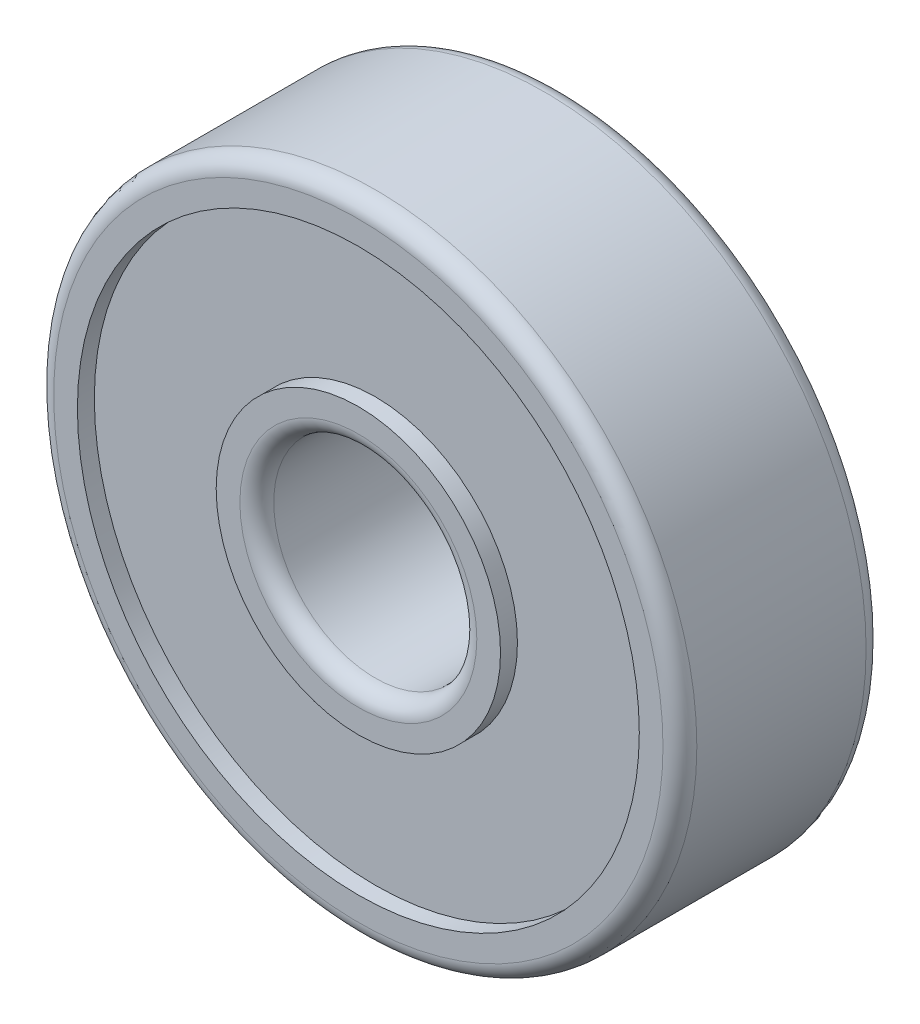
ISO-10303-21;
HEADER;
FILE_DESCRIPTION(('STEP AP214'),'2;1');
FILE_NAME('part.step','',(''),(''),'','','');
FILE_SCHEMA(('AUTOMOTIVE_DESIGN { 1 0 10303 214 1 1 1 1 }'));
ENDSEC;
DATA;
#1=APPLICATION_CONTEXT('core data for automotive mechanical design processes');
#2=APPLICATION_PROTOCOL_DEFINITION('international standard','automotive_design',2000,#1);
#3=PRODUCT_CONTEXT('',#1,'mechanical');
#4=PRODUCT('Part','Part','',(#3));
#5=PRODUCT_RELATED_PRODUCT_CATEGORY('part','',(#4));
#6=PRODUCT_DEFINITION_FORMATION('','',#4);
#7=PRODUCT_DEFINITION_CONTEXT('part definition',#1,'design');
#8=PRODUCT_DEFINITION('design','',#6,#7);
#9=PRODUCT_DEFINITION_SHAPE('','',#8);
#10=(LENGTH_UNIT() NAMED_UNIT(*) SI_UNIT(.MILLI.,.METRE.));
#11=(NAMED_UNIT(*) PLANE_ANGLE_UNIT() SI_UNIT($,.RADIAN.));
#12=(NAMED_UNIT(*) SI_UNIT($,.STERADIAN.) SOLID_ANGLE_UNIT());
#13=UNCERTAINTY_MEASURE_WITH_UNIT(LENGTH_MEASURE(1.E-05),#10,'distance_accuracy_value','');
#14=(GEOMETRIC_REPRESENTATION_CONTEXT(3) GLOBAL_UNCERTAINTY_ASSIGNED_CONTEXT((#13)) GLOBAL_UNIT_ASSIGNED_CONTEXT((#10,
#11,#12)) REPRESENTATION_CONTEXT('',''));
#15=CARTESIAN_POINT('',(0.,0.,0.));
#16=DIRECTION('',(0.,0.,1.));
#17=DIRECTION('',(1.,0.,0.));
#18=AXIS2_PLACEMENT_3D('',#15,#16,#17);
#19=CARTESIAN_POINT('',(0.,0.,0.));
#20=DIRECTION('',(0.,0.,1.));
#21=DIRECTION('',(1.,0.,0.));
#22=AXIS2_PLACEMENT_3D('',#19,#20,#21);
#23=PLANE('',#22);
#24=CARTESIAN_POINT('',(0.,0.,0.));
#25=DIRECTION('',(0.,0.,1.));
#26=DIRECTION('',(1.,0.,0.));
#27=AXIS2_PLACEMENT_3D('',#24,#25,#26);
#28=CIRCLE('',#27,3.5);
#29=CARTESIAN_POINT('',(3.5,0.,0.));
#30=VERTEX_POINT('',#29);
#31=EDGE_CURVE('E72',#30,#30,#28,.T.);
#32=ORIENTED_EDGE('',*,*,#31,.T.);
#33=EDGE_LOOP('',(#32));
#34=FACE_BOUND('',#33,.T.);
#35=CARTESIAN_POINT('',(0.,0.,0.));
#36=DIRECTION('',(0.,0.,-1.));
#37=DIRECTION('',(-1.,0.,0.));
#38=AXIS2_PLACEMENT_3D('',#35,#36,#37);
#39=CIRCLE('',#38,4.2);
#40=CARTESIAN_POINT('',(-4.2,0.,0.));
#41=VERTEX_POINT('',#40);
#42=EDGE_CURVE('E94',#41,#41,#39,.T.);
#43=ORIENTED_EDGE('',*,*,#42,.T.);
#44=EDGE_LOOP('',(#43));
#45=FACE_BOUND('',#44,.T.);
#46=ADVANCED_FACE('F43',(#34,#45),#23,.F.);
#47=CARTESIAN_POINT('',(0.,0.,6.));
#48=DIRECTION('',(0.,0.,1.));
#49=DIRECTION('',(1.,0.,0.));
#50=AXIS2_PLACEMENT_3D('',#47,#48,#49);
#51=PLANE('',#50);
#52=CARTESIAN_POINT('',(0.,0.,6.));
#53=DIRECTION('',(0.,0.,1.));
#54=DIRECTION('',(1.,0.,0.));
#55=AXIS2_PLACEMENT_3D('',#52,#53,#54);
#56=CIRCLE('',#55,3.5);
#57=CARTESIAN_POINT('',(3.5,0.,6.));
#58=VERTEX_POINT('',#57);
#59=EDGE_CURVE('E63',#58,#58,#56,.F.);
#60=ORIENTED_EDGE('',*,*,#59,.T.);
#61=EDGE_LOOP('',(#60));
#62=FACE_BOUND('',#61,.T.);
#63=CARTESIAN_POINT('',(0.,0.,6.));
#64=DIRECTION('',(0.,0.,1.));
#65=DIRECTION('',(1.,0.,0.));
#66=AXIS2_PLACEMENT_3D('',#63,#64,#65);
#67=CIRCLE('',#66,4.2);
#68=CARTESIAN_POINT('',(4.2,0.,6.));
#69=VERTEX_POINT('',#68);
#70=EDGE_CURVE('E82',#69,#69,#67,.T.);
#71=ORIENTED_EDGE('',*,*,#70,.T.);
#72=EDGE_LOOP('',(#71));
#73=FACE_BOUND('',#72,.T.);
#74=ADVANCED_FACE('F128',(#62,#73),#51,.T.);
#75=CARTESIAN_POINT('',(0.,0.,6.));
#76=DIRECTION('',(0.,0.,1.));
#77=DIRECTION('',(1.,0.,0.));
#78=AXIS2_PLACEMENT_3D('',#75,#76,#77);
#79=CIRCLE('',#78,9.);
#80=CARTESIAN_POINT('',(9.,0.,6.));
#81=VERTEX_POINT('',#80);
#82=EDGE_CURVE('E10',#81,#81,#79,.T.);
#83=ORIENTED_EDGE('',*,*,#82,.T.);
#84=EDGE_LOOP('',(#83));
#85=FACE_BOUND('',#84,.T.);
#86=CARTESIAN_POINT('',(0.,0.,6.));
#87=DIRECTION('',(0.,0.,1.));
#88=DIRECTION('',(1.,0.,0.));
#89=AXIS2_PLACEMENT_3D('',#86,#87,#88);
#90=CIRCLE('',#89,8.3);
#91=CARTESIAN_POINT('',(8.3,0.,6.));
#92=VERTEX_POINT('',#91);
#93=EDGE_CURVE('E76',#92,#92,#90,.T.);
#94=ORIENTED_EDGE('',*,*,#93,.F.);
#95=EDGE_LOOP('',(#94));
#96=FACE_BOUND('',#95,.T.);
#97=ADVANCED_FACE('F119',(#85,#96),#51,.T.);
#98=CARTESIAN_POINT('',(0.,0.,0.));
#99=DIRECTION('',(0.,0.,1.));
#100=DIRECTION('',(1.,0.,0.));
#101=AXIS2_PLACEMENT_3D('',#98,#99,#100);
#102=CIRCLE('',#101,9.);
#103=CARTESIAN_POINT('',(9.,0.,0.));
#104=VERTEX_POINT('',#103);
#105=EDGE_CURVE('E50',#104,#104,#102,.F.);
#106=ORIENTED_EDGE('',*,*,#105,.T.);
#107=EDGE_LOOP('',(#106));
#108=FACE_BOUND('',#107,.T.);
#109=CARTESIAN_POINT('',(0.,0.,0.));
#110=DIRECTION('',(0.,0.,-1.));
#111=DIRECTION('',(-1.,0.,0.));
#112=AXIS2_PLACEMENT_3D('',#109,#110,#111);
#113=CIRCLE('',#112,8.3);
#114=CARTESIAN_POINT('',(-8.3,0.,0.));
#115=VERTEX_POINT('',#114);
#116=EDGE_CURVE('E88',#115,#115,#113,.T.);
#117=ORIENTED_EDGE('',*,*,#116,.F.);
#118=EDGE_LOOP('',(#117));
#119=FACE_BOUND('',#118,.T.);
#120=ADVANCED_FACE('F116',(#108,#119),#23,.F.);
#121=CARTESIAN_POINT('',(0.,0.,6.));
#122=DIRECTION('',(0.,0.,-1.));
#123=DIRECTION('',(-1.,0.,0.));
#124=AXIS2_PLACEMENT_3D('',#121,#122,#123);
#125=CYLINDRICAL_SURFACE('',#124,9.5);
#126=CARTESIAN_POINT('',(0.,0.,0.5));
#127=DIRECTION('',(0.,0.,1.));
#128=DIRECTION('',(1.,0.,0.));
#129=AXIS2_PLACEMENT_3D('',#126,#127,#128);
#130=CIRCLE('',#129,9.5);
#131=CARTESIAN_POINT('',(9.5,0.,0.5));
#132=VERTEX_POINT('',#131);
#133=EDGE_CURVE('E54',#132,#132,#130,.T.);
#134=ORIENTED_EDGE('',*,*,#133,.T.);
#135=EDGE_LOOP('',(#134));
#136=FACE_BOUND('',#135,.T.);
#137=CARTESIAN_POINT('',(0.,0.,5.5));
#138=DIRECTION('',(0.,0.,1.));
#139=DIRECTION('',(1.,0.,0.));
#140=AXIS2_PLACEMENT_3D('',#137,#138,#139);
#141=CIRCLE('',#140,9.5);
#142=CARTESIAN_POINT('',(9.5,0.,5.5));
#143=VERTEX_POINT('',#142);
#144=EDGE_CURVE('E58',#143,#143,#141,.F.);
#145=ORIENTED_EDGE('',*,*,#144,.T.);
#146=EDGE_LOOP('',(#145));
#147=FACE_BOUND('',#146,.T.);
#148=ADVANCED_FACE('F118',(#136,#147),#125,.T.);
#149=CARTESIAN_POINT('',(0.,0.,6.));
#150=DIRECTION('',(0.,0.,-1.));
#151=DIRECTION('',(-1.,0.,0.));
#152=AXIS2_PLACEMENT_3D('',#149,#150,#151);
#153=CYLINDRICAL_SURFACE('',#152,3.);
#154=CARTESIAN_POINT('',(0.,0.,0.5));
#155=DIRECTION('',(0.,0.,1.));
#156=DIRECTION('',(1.,0.,0.));
#157=AXIS2_PLACEMENT_3D('',#154,#155,#156);
#158=CIRCLE('',#157,3.);
#159=CARTESIAN_POINT('',(3.,0.,0.5));
#160=VERTEX_POINT('',#159);
#161=EDGE_CURVE('E66',#160,#160,#158,.F.);
#162=ORIENTED_EDGE('',*,*,#161,.T.);
#163=EDGE_LOOP('',(#162));
#164=FACE_BOUND('',#163,.T.);
#165=CARTESIAN_POINT('',(0.,0.,5.5));
#166=DIRECTION('',(0.,0.,1.));
#167=DIRECTION('',(1.,0.,0.));
#168=AXIS2_PLACEMENT_3D('',#165,#166,#167);
#169=CIRCLE('',#168,3.);
#170=CARTESIAN_POINT('',(3.,0.,5.5));
#171=VERTEX_POINT('',#170);
#172=EDGE_CURVE('E69',#171,#171,#169,.T.);
#173=ORIENTED_EDGE('',*,*,#172,.T.);
#174=EDGE_LOOP('',(#173));
#175=FACE_BOUND('',#174,.T.);
#176=ADVANCED_FACE('F125',(#164,#175),#153,.F.);
#177=CARTESIAN_POINT('',(0.,0.,5.5));
#178=DIRECTION('',(0.,0.,1.));
#179=DIRECTION('',(1.,0.,0.));
#180=AXIS2_PLACEMENT_3D('',#177,#178,#179);
#181=CYLINDRICAL_SURFACE('',#180,8.3);
#182=CARTESIAN_POINT('',(0.,0.,5.5));
#183=DIRECTION('',(0.,0.,1.));
#184=DIRECTION('',(1.,0.,0.));
#185=AXIS2_PLACEMENT_3D('',#182,#183,#184);
#186=CIRCLE('',#185,8.3);
#187=CARTESIAN_POINT('',(8.3,0.,5.5));
#188=VERTEX_POINT('',#187);
#189=EDGE_CURVE('E75',#188,#188,#186,.T.);
#190=ORIENTED_EDGE('',*,*,#189,.F.);
#191=EDGE_LOOP('',(#190));
#192=FACE_BOUND('',#191,.T.);
#193=ORIENTED_EDGE('',*,*,#93,.T.);
#194=EDGE_LOOP('',(#193));
#195=FACE_BOUND('',#194,.T.);
#196=ADVANCED_FACE('F155',(#192,#195),#181,.F.);
#197=CARTESIAN_POINT('',(0.,0.,5.5));
#198=DIRECTION('',(0.,0.,1.));
#199=DIRECTION('',(1.,0.,0.));
#200=AXIS2_PLACEMENT_3D('',#197,#198,#199);
#201=PLANE('',#200);
#202=CARTESIAN_POINT('',(0.,0.,5.5));
#203=DIRECTION('',(0.,0.,1.));
#204=DIRECTION('',(1.,0.,0.));
#205=AXIS2_PLACEMENT_3D('',#202,#203,#204);
#206=CIRCLE('',#205,4.2);
#207=CARTESIAN_POINT('',(4.2,0.,5.5));
#208=VERTEX_POINT('',#207);
#209=EDGE_CURVE('E79',#208,#208,#206,.T.);
#210=ORIENTED_EDGE('',*,*,#209,.F.);
#211=EDGE_LOOP('',(#210));
#212=FACE_BOUND('',#211,.T.);
#213=ORIENTED_EDGE('',*,*,#189,.T.);
#214=EDGE_LOOP('',(#213));
#215=FACE_BOUND('',#214,.T.);
#216=ADVANCED_FACE('F151',(#212,#215),#201,.T.);
#217=CARTESIAN_POINT('',(0.,0.,5.5));
#218=DIRECTION('',(0.,0.,1.));
#219=DIRECTION('',(1.,0.,0.));
#220=AXIS2_PLACEMENT_3D('',#217,#218,#219);
#221=CYLINDRICAL_SURFACE('',#220,4.2);
#222=ORIENTED_EDGE('',*,*,#209,.T.);
#223=EDGE_LOOP('',(#222));
#224=FACE_BOUND('',#223,.T.);
#225=ORIENTED_EDGE('',*,*,#70,.F.);
#226=EDGE_LOOP('',(#225));
#227=FACE_BOUND('',#226,.T.);
#228=ADVANCED_FACE('F112',(#224,#227),#221,.T.);
#229=CARTESIAN_POINT('',(0.,0.,0.5));
#230=DIRECTION('',(0.,0.,-1.));
#231=DIRECTION('',(-1.,0.,0.));
#232=AXIS2_PLACEMENT_3D('',#229,#230,#231);
#233=CYLINDRICAL_SURFACE('',#232,8.3);
#234=CARTESIAN_POINT('',(0.,0.,0.5));
#235=DIRECTION('',(0.,0.,-1.));
#236=DIRECTION('',(-1.,0.,0.));
#237=AXIS2_PLACEMENT_3D('',#234,#235,#236);
#238=CIRCLE('',#237,8.3);
#239=CARTESIAN_POINT('',(-8.3,0.,0.5));
#240=VERTEX_POINT('',#239);
#241=EDGE_CURVE('E85',#240,#240,#238,.T.);
#242=ORIENTED_EDGE('',*,*,#241,.F.);
#243=EDGE_LOOP('',(#242));
#244=FACE_BOUND('',#243,.T.);
#245=ORIENTED_EDGE('',*,*,#116,.T.);
#246=EDGE_LOOP('',(#245));
#247=FACE_BOUND('',#246,.T.);
#248=ADVANCED_FACE('F106',(#244,#247),#233,.F.);
#249=CARTESIAN_POINT('',(0.,0.,0.5));
#250=DIRECTION('',(0.,0.,-1.));
#251=DIRECTION('',(-1.,0.,0.));
#252=AXIS2_PLACEMENT_3D('',#249,#250,#251);
#253=PLANE('',#252);
#254=CARTESIAN_POINT('',(0.,0.,0.5));
#255=DIRECTION('',(0.,0.,-1.));
#256=DIRECTION('',(-1.,0.,0.));
#257=AXIS2_PLACEMENT_3D('',#254,#255,#256);
#258=CIRCLE('',#257,4.2);
#259=CARTESIAN_POINT('',(-4.2,0.,0.5));
#260=VERTEX_POINT('',#259);
#261=EDGE_CURVE('E91',#260,#260,#258,.T.);
#262=ORIENTED_EDGE('',*,*,#261,.F.);
#263=EDGE_LOOP('',(#262));
#264=FACE_BOUND('',#263,.T.);
#265=ORIENTED_EDGE('',*,*,#241,.T.);
#266=EDGE_LOOP('',(#265));
#267=FACE_BOUND('',#266,.T.);
#268=ADVANCED_FACE('F103',(#264,#267),#253,.T.);
#269=CARTESIAN_POINT('',(0.,0.,0.5));
#270=DIRECTION('',(0.,0.,-1.));
#271=DIRECTION('',(-1.,0.,0.));
#272=AXIS2_PLACEMENT_3D('',#269,#270,#271);
#273=CYLINDRICAL_SURFACE('',#272,4.2);
#274=ORIENTED_EDGE('',*,*,#261,.T.);
#275=EDGE_LOOP('',(#274));
#276=FACE_BOUND('',#275,.T.);
#277=ORIENTED_EDGE('',*,*,#42,.F.);
#278=EDGE_LOOP('',(#277));
#279=FACE_BOUND('',#278,.T.);
#280=ADVANCED_FACE('F100',(#276,#279),#273,.T.);
#281=CARTESIAN_POINT('',(0.,0.,0.5));
#282=DIRECTION('',(0.,0.,1.));
#283=DIRECTION('',(1.,0.,0.));
#284=AXIS2_PLACEMENT_3D('',#281,#282,#283);
#285=TOROIDAL_SURFACE('',#284,3.5,0.5);
#286=ORIENTED_EDGE('',*,*,#161,.F.);
#287=EDGE_LOOP('',(#286));
#288=FACE_BOUND('',#287,.T.);
#289=ORIENTED_EDGE('',*,*,#31,.F.);
#290=EDGE_LOOP('',(#289));
#291=FACE_BOUND('',#290,.T.);
#292=ADVANCED_FACE('F140',(#288,#291),#285,.T.);
#293=CARTESIAN_POINT('',(0.,0.,5.5));
#294=DIRECTION('',(0.,0.,1.));
#295=DIRECTION('',(1.,0.,0.));
#296=AXIS2_PLACEMENT_3D('',#293,#294,#295);
#297=TOROIDAL_SURFACE('',#296,3.5,0.5);
#298=ORIENTED_EDGE('',*,*,#59,.F.);
#299=EDGE_LOOP('',(#298));
#300=FACE_BOUND('',#299,.T.);
#301=ORIENTED_EDGE('',*,*,#172,.F.);
#302=EDGE_LOOP('',(#301));
#303=FACE_BOUND('',#302,.T.);
#304=ADVANCED_FACE('F145',(#300,#303),#297,.T.);
#305=CARTESIAN_POINT('',(0.,0.,0.5));
#306=DIRECTION('',(0.,0.,1.));
#307=DIRECTION('',(1.,0.,0.));
#308=AXIS2_PLACEMENT_3D('',#305,#306,#307);
#309=TOROIDAL_SURFACE('',#308,9.,0.5);
#310=ORIENTED_EDGE('',*,*,#105,.F.);
#311=EDGE_LOOP('',(#310));
#312=FACE_BOUND('',#311,.T.);
#313=ORIENTED_EDGE('',*,*,#133,.F.);
#314=EDGE_LOOP('',(#313));
#315=FACE_BOUND('',#314,.T.);
#316=ADVANCED_FACE('F169',(#312,#315),#309,.T.);
#317=CARTESIAN_POINT('',(0.,0.,5.5));
#318=DIRECTION('',(0.,0.,1.));
#319=DIRECTION('',(1.,0.,0.));
#320=AXIS2_PLACEMENT_3D('',#317,#318,#319);
#321=TOROIDAL_SURFACE('',#320,9.,0.5);
#322=ORIENTED_EDGE('',*,*,#144,.F.);
#323=EDGE_LOOP('',(#322));
#324=FACE_BOUND('',#323,.T.);
#325=ORIENTED_EDGE('',*,*,#82,.F.);
#326=EDGE_LOOP('',(#325));
#327=FACE_BOUND('',#326,.T.);
#328=ADVANCED_FACE('F45',(#324,#327),#321,.T.);
#329=CLOSED_SHELL('',(#46,#74,#97,#120,#148,#176,#196,#216,#228,#248,#268,#280,#292,#304,#316,#328));
#330=MANIFOLD_SOLID_BREP('B2',#329);
#331=ADVANCED_BREP_SHAPE_REPRESENTATION('',(#18,#330),#14);
#332=SHAPE_DEFINITION_REPRESENTATION(#9,#331);
ENDSEC;
END-ISO-10303-21;
